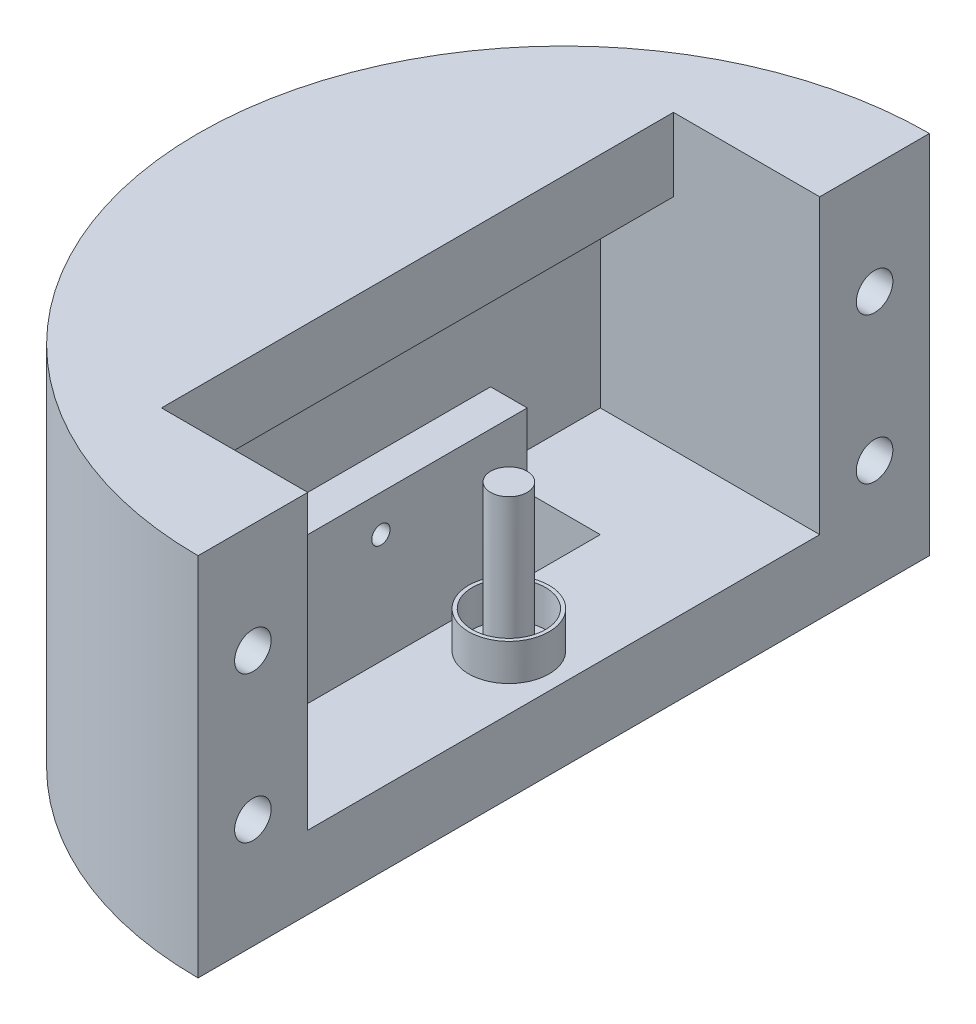
ISO-10303-21;
HEADER;
FILE_DESCRIPTION(('STEP AP214'),'2;1');
FILE_NAME('part.step','',(''),(''),'','','');
FILE_SCHEMA(('AUTOMOTIVE_DESIGN { 1 0 10303 214 1 1 1 1 }'));
ENDSEC;
DATA;
#1=APPLICATION_CONTEXT('core data for automotive mechanical design processes');
#2=APPLICATION_PROTOCOL_DEFINITION('international standard','automotive_design',2000,#1);
#3=PRODUCT_CONTEXT('',#1,'mechanical');
#4=PRODUCT('Part','Part','',(#3));
#5=PRODUCT_RELATED_PRODUCT_CATEGORY('part','',(#4));
#6=PRODUCT_DEFINITION_FORMATION('','',#4);
#7=PRODUCT_DEFINITION_CONTEXT('part definition',#1,'design');
#8=PRODUCT_DEFINITION('design','',#6,#7);
#9=PRODUCT_DEFINITION_SHAPE('','',#8);
#10=(LENGTH_UNIT() NAMED_UNIT(*) SI_UNIT(.MILLI.,.METRE.));
#11=(NAMED_UNIT(*) PLANE_ANGLE_UNIT() SI_UNIT($,.RADIAN.));
#12=(NAMED_UNIT(*) SI_UNIT($,.STERADIAN.) SOLID_ANGLE_UNIT());
#13=UNCERTAINTY_MEASURE_WITH_UNIT(LENGTH_MEASURE(1.E-05),#10,'distance_accuracy_value','');
#14=(GEOMETRIC_REPRESENTATION_CONTEXT(3) GLOBAL_UNCERTAINTY_ASSIGNED_CONTEXT((#13)) GLOBAL_UNIT_ASSIGNED_CONTEXT((#10,
#11,#12)) REPRESENTATION_CONTEXT('',''));
#15=CARTESIAN_POINT('',(0.,0.,0.));
#16=DIRECTION('',(0.,0.,1.));
#17=DIRECTION('',(1.,0.,0.));
#18=AXIS2_PLACEMENT_3D('',#15,#16,#17);
#19=CARTESIAN_POINT('',(-0.5,5.,-3.5));
#20=DIRECTION('',(1.,0.,0.));
#21=DIRECTION('',(0.,0.,-1.));
#22=AXIS2_PLACEMENT_3D('',#19,#20,#21);
#23=PLANE('',#22);
#24=DIRECTION('',(0.,-1.,0.));
#25=VECTOR('',#24,1.);
#26=CARTESIAN_POINT('',(-0.5,5.,-3.5));
#27=LINE('',#26,#25);
#28=CARTESIAN_POINT('',(-0.5,4.,-3.5));
#29=VERTEX_POINT('',#28);
#30=CARTESIAN_POINT('',(-0.5,1.,-3.5));
#31=VERTEX_POINT('',#30);
#32=EDGE_CURVE('E204',#29,#31,#27,.T.);
#33=ORIENTED_EDGE('',*,*,#32,.F.);
#34=DIRECTION('',(0.,0.,-1.));
#35=VECTOR('',#34,1.);
#36=CARTESIAN_POINT('',(-0.5,4.,-3.5));
#37=LINE('',#36,#35);
#38=CARTESIAN_POINT('',(-0.5,4.,3.5));
#39=VERTEX_POINT('',#38);
#40=EDGE_CURVE('E298',#39,#29,#37,.T.);
#41=ORIENTED_EDGE('',*,*,#40,.F.);
#42=DIRECTION('',(0.,-1.,0.));
#43=VECTOR('',#42,1.);
#44=CARTESIAN_POINT('',(-0.5,5.,3.5));
#45=LINE('',#44,#43);
#46=CARTESIAN_POINT('',(-0.5,1.,3.5));
#47=VERTEX_POINT('',#46);
#48=EDGE_CURVE('E221',#39,#47,#45,.T.);
#49=ORIENTED_EDGE('',*,*,#48,.T.);
#50=DIRECTION('',(0.,0.,1.));
#51=VECTOR('',#50,1.);
#52=CARTESIAN_POINT('',(-0.5,1.,-3.5));
#53=LINE('',#52,#51);
#54=CARTESIAN_POINT('',(-0.5,1.,2.));
#55=VERTEX_POINT('',#54);
#56=EDGE_CURVE('E208',#55,#47,#53,.T.);
#57=ORIENTED_EDGE('',*,*,#56,.F.);
#58=DIRECTION('',(0.,-1.,0.));
#59=VECTOR('',#58,1.);
#60=CARTESIAN_POINT('',(-0.5,2.,2.));
#61=LINE('',#60,#59);
#62=CARTESIAN_POINT('',(-0.5,2.,2.));
#63=VERTEX_POINT('',#62);
#64=EDGE_CURVE('E174',#63,#55,#61,.T.);
#65=ORIENTED_EDGE('',*,*,#64,.F.);
#66=DIRECTION('',(0.,0.,1.));
#67=VECTOR('',#66,1.);
#68=CARTESIAN_POINT('',(-0.5,2.,-2.));
#69=LINE('',#68,#67);
#70=CARTESIAN_POINT('',(-0.5,2.,-2.));
#71=VERTEX_POINT('',#70);
#72=EDGE_CURVE('E154',#71,#63,#69,.T.);
#73=ORIENTED_EDGE('',*,*,#72,.F.);
#74=DIRECTION('',(0.,-1.,0.));
#75=VECTOR('',#74,1.);
#76=CARTESIAN_POINT('',(-0.5,2.,-2.));
#77=LINE('',#76,#75);
#78=CARTESIAN_POINT('',(-0.5,1.,-2.));
#79=VERTEX_POINT('',#78);
#80=EDGE_CURVE('E151',#71,#79,#77,.T.);
#81=ORIENTED_EDGE('',*,*,#80,.T.);
#82=EDGE_CURVE('E209',#31,#79,#53,.T.);
#83=ORIENTED_EDGE('',*,*,#82,.F.);
#84=EDGE_LOOP('',(#33,#41,#49,#57,#65,#73,#81,#83));
#85=FACE_BOUND('',#84,.T.);
#86=ADVANCED_FACE('F33',(#85),#23,.T.);
#87=CARTESIAN_POINT('',(2.5,5.,-3.5));
#88=DIRECTION('',(0.,0.,1.));
#89=DIRECTION('',(1.,0.,0.));
#90=AXIS2_PLACEMENT_3D('',#87,#88,#89);
#91=PLANE('',#90);
#92=DIRECTION('',(0.,1.,0.));
#93=VECTOR('',#92,1.);
#94=CARTESIAN_POINT('',(0.5,5.,-3.5));
#95=LINE('',#94,#93);
#96=CARTESIAN_POINT('',(0.5,4.,-3.5));
#97=VERTEX_POINT('',#96);
#98=CARTESIAN_POINT('',(0.5,5.,-3.5));
#99=VERTEX_POINT('',#98);
#100=EDGE_CURVE('E48',#97,#99,#95,.T.);
#101=ORIENTED_EDGE('',*,*,#100,.F.);
#102=DIRECTION('',(-1.,0.,0.));
#103=VECTOR('',#102,1.);
#104=CARTESIAN_POINT('',(0.5,4.,-3.5));
#105=LINE('',#104,#103);
#106=EDGE_CURVE('E53',#97,#29,#105,.T.);
#107=ORIENTED_EDGE('',*,*,#106,.T.);
#108=ORIENTED_EDGE('',*,*,#32,.T.);
#109=DIRECTION('',(-1.,0.,0.));
#110=VECTOR('',#109,1.);
#111=CARTESIAN_POINT('',(2.5,1.,-3.5));
#112=LINE('',#111,#110);
#113=CARTESIAN_POINT('',(2.5,1.,-3.5));
#114=VERTEX_POINT('',#113);
#115=EDGE_CURVE('E205',#114,#31,#112,.T.);
#116=ORIENTED_EDGE('',*,*,#115,.F.);
#117=DIRECTION('',(0.,-1.,0.));
#118=VECTOR('',#117,1.);
#119=CARTESIAN_POINT('',(2.5,5.,-3.5));
#120=LINE('',#119,#118);
#121=CARTESIAN_POINT('',(2.5,5.,-3.5));
#122=VERTEX_POINT('',#121);
#123=EDGE_CURVE('E214',#122,#114,#120,.T.);
#124=ORIENTED_EDGE('',*,*,#123,.F.);
#125=DIRECTION('',(-1.,0.,0.));
#126=VECTOR('',#125,1.);
#127=CARTESIAN_POINT('',(2.5,5.,-3.5));
#128=LINE('',#127,#126);
#129=EDGE_CURVE('E192',#122,#99,#128,.T.);
#130=ORIENTED_EDGE('',*,*,#129,.T.);
#131=EDGE_LOOP('',(#101,#107,#108,#116,#124,#130));
#132=FACE_BOUND('',#131,.T.);
#133=ADVANCED_FACE('F341',(#132),#91,.T.);
#134=CARTESIAN_POINT('',(2.5,5.,3.5));
#135=DIRECTION('',(0.,0.,1.));
#136=DIRECTION('',(1.,0.,0.));
#137=AXIS2_PLACEMENT_3D('',#134,#135,#136);
#138=PLANE('',#137);
#139=DIRECTION('',(-1.,0.,0.));
#140=VECTOR('',#139,1.);
#141=CARTESIAN_POINT('',(0.5,4.,3.5));
#142=LINE('',#141,#140);
#143=CARTESIAN_POINT('',(0.5,4.,3.5));
#144=VERTEX_POINT('',#143);
#145=EDGE_CURVE('E266',#144,#39,#142,.T.);
#146=ORIENTED_EDGE('',*,*,#145,.F.);
#147=DIRECTION('',(0.,-1.,0.));
#148=VECTOR('',#147,1.);
#149=CARTESIAN_POINT('',(0.5,5.,3.5));
#150=LINE('',#149,#148);
#151=CARTESIAN_POINT('',(0.5,5.,3.5));
#152=VERTEX_POINT('',#151);
#153=EDGE_CURVE('E306',#152,#144,#150,.T.);
#154=ORIENTED_EDGE('',*,*,#153,.F.);
#155=DIRECTION('',(-1.,0.,0.));
#156=VECTOR('',#155,1.);
#157=CARTESIAN_POINT('',(2.5,5.,3.5));
#158=LINE('',#157,#156);
#159=CARTESIAN_POINT('',(2.5,5.,3.5));
#160=VERTEX_POINT('',#159);
#161=EDGE_CURVE('E194',#160,#152,#158,.T.);
#162=ORIENTED_EDGE('',*,*,#161,.F.);
#163=DIRECTION('',(0.,-1.,0.));
#164=VECTOR('',#163,1.);
#165=CARTESIAN_POINT('',(2.5,5.,3.5));
#166=LINE('',#165,#164);
#167=CARTESIAN_POINT('',(2.5,1.,3.5));
#168=VERTEX_POINT('',#167);
#169=EDGE_CURVE('E218',#160,#168,#166,.T.);
#170=ORIENTED_EDGE('',*,*,#169,.T.);
#171=DIRECTION('',(-1.,0.,0.));
#172=VECTOR('',#171,1.);
#173=CARTESIAN_POINT('',(2.5,1.,3.5));
#174=LINE('',#173,#172);
#175=EDGE_CURVE('E195',#168,#47,#174,.T.);
#176=ORIENTED_EDGE('',*,*,#175,.T.);
#177=ORIENTED_EDGE('',*,*,#48,.F.);
#178=EDGE_LOOP('',(#146,#154,#162,#170,#176,#177));
#179=FACE_BOUND('',#178,.T.);
#180=ADVANCED_FACE('F300',(#179),#138,.F.);
#181=CARTESIAN_POINT('',(0.,1.,0.));
#182=DIRECTION('',(0.,-1.,0.));
#183=DIRECTION('',(0.,0.,-1.));
#184=AXIS2_PLACEMENT_3D('',#181,#182,#183);
#185=PLANE('',#184);
#186=CARTESIAN_POINT('',(1.75,1.,0.));
#187=DIRECTION('',(0.,-1.,0.));
#188=DIRECTION('',(0.,0.,-1.));
#189=AXIS2_PLACEMENT_3D('',#186,#187,#188);
#190=CIRCLE('',#189,0.55);
#191=CARTESIAN_POINT('',(1.75,1.,-0.549999999999999));
#192=VERTEX_POINT('',#191);
#193=EDGE_CURVE('E11',#192,#192,#190,.F.);
#194=ORIENTED_EDGE('',*,*,#193,.F.);
#195=EDGE_LOOP('',(#194));
#196=FACE_BOUND('',#195,.T.);
#197=DIRECTION('',(-1.,0.,0.));
#198=VECTOR('',#197,1.);
#199=CARTESIAN_POINT('',(0.,1.,-2.));
#200=LINE('',#199,#198);
#201=CARTESIAN_POINT('',(0.,1.,-2.));
#202=VERTEX_POINT('',#201);
#203=EDGE_CURVE('E278',#202,#79,#200,.T.);
#204=ORIENTED_EDGE('',*,*,#203,.F.);
#205=DIRECTION('',(-1.,0.,0.));
#206=VECTOR('',#205,1.);
#207=CARTESIAN_POINT('',(0.,1.,-2.));
#208=LINE('',#207,#206);
#209=CARTESIAN_POINT('',(1.,1.,-2.));
#210=VERTEX_POINT('',#209);
#211=EDGE_CURVE('E172',#210,#202,#208,.T.);
#212=ORIENTED_EDGE('',*,*,#211,.F.);
#213=DIRECTION('',(0.,0.,-1.));
#214=VECTOR('',#213,1.);
#215=CARTESIAN_POINT('',(1.,1.,-2.));
#216=LINE('',#215,#214);
#217=CARTESIAN_POINT('',(1.,1.,2.));
#218=VERTEX_POINT('',#217);
#219=EDGE_CURVE('E170',#218,#210,#216,.T.);
#220=ORIENTED_EDGE('',*,*,#219,.F.);
#221=DIRECTION('',(1.,0.,0.));
#222=VECTOR('',#221,1.);
#223=CARTESIAN_POINT('',(0.,1.,2.));
#224=LINE('',#223,#222);
#225=CARTESIAN_POINT('',(0.,1.,2.));
#226=VERTEX_POINT('',#225);
#227=EDGE_CURVE('E179',#226,#218,#224,.T.);
#228=ORIENTED_EDGE('',*,*,#227,.F.);
#229=DIRECTION('',(1.,0.,0.));
#230=VECTOR('',#229,1.);
#231=CARTESIAN_POINT('',(0.,1.,2.));
#232=LINE('',#231,#230);
#233=EDGE_CURVE('E163',#55,#226,#232,.T.);
#234=ORIENTED_EDGE('',*,*,#233,.F.);
#235=ORIENTED_EDGE('',*,*,#56,.T.);
#236=ORIENTED_EDGE('',*,*,#175,.F.);
#237=DIRECTION('',(0.,0.,-1.));
#238=VECTOR('',#237,1.);
#239=CARTESIAN_POINT('',(2.5,1.,5.));
#240=LINE('',#239,#238);
#241=EDGE_CURVE('E224',#168,#114,#240,.T.);
#242=ORIENTED_EDGE('',*,*,#241,.T.);
#243=ORIENTED_EDGE('',*,*,#115,.T.);
#244=ORIENTED_EDGE('',*,*,#82,.T.);
#245=EDGE_LOOP('',(#204,#212,#220,#228,#234,#235,#236,#242,#243,#244));
#246=FACE_BOUND('',#245,.T.);
#247=ADVANCED_FACE('F260',(#196,#246),#185,.F.);
#248=CARTESIAN_POINT('',(2.5,1.,5.));
#249=DIRECTION('',(-1.,0.,0.));
#250=DIRECTION('',(0.,0.,1.));
#251=AXIS2_PLACEMENT_3D('',#248,#249,#250);
#252=PLANE('',#251);
#253=CARTESIAN_POINT('',(2.5,1.50311049925089,-4.25));
#254=DIRECTION('',(1.,0.,0.));
#255=DIRECTION('',(0.,0.,-1.));
#256=AXIS2_PLACEMENT_3D('',#253,#254,#255);
#257=CIRCLE('',#256,0.25);
#258=CARTESIAN_POINT('',(2.5,1.50311049925089,-4.5));
#259=VERTEX_POINT('',#258);
#260=EDGE_CURVE('E321',#259,#259,#257,.T.);
#261=ORIENTED_EDGE('',*,*,#260,.F.);
#262=EDGE_LOOP('',(#261));
#263=FACE_BOUND('',#262,.T.);
#264=CARTESIAN_POINT('',(2.5,3.50311049925089,4.25));
#265=DIRECTION('',(1.,0.,0.));
#266=DIRECTION('',(0.,0.,-1.));
#267=AXIS2_PLACEMENT_3D('',#264,#265,#266);
#268=CIRCLE('',#267,0.249999999999999);
#269=CARTESIAN_POINT('',(2.5,3.50311049925089,4.));
#270=VERTEX_POINT('',#269);
#271=EDGE_CURVE('E482',#270,#270,#268,.T.);
#272=ORIENTED_EDGE('',*,*,#271,.F.);
#273=EDGE_LOOP('',(#272));
#274=FACE_BOUND('',#273,.T.);
#275=CARTESIAN_POINT('',(2.5,1.50311049925089,4.25));
#276=DIRECTION('',(1.,0.,0.));
#277=DIRECTION('',(0.,0.,-1.));
#278=AXIS2_PLACEMENT_3D('',#275,#276,#277);
#279=CIRCLE('',#278,0.25);
#280=CARTESIAN_POINT('',(2.5,1.50311049925089,4.));
#281=VERTEX_POINT('',#280);
#282=EDGE_CURVE('E471',#281,#281,#279,.T.);
#283=ORIENTED_EDGE('',*,*,#282,.F.);
#284=EDGE_LOOP('',(#283));
#285=FACE_BOUND('',#284,.T.);
#286=CARTESIAN_POINT('',(2.5,3.50311049925089,-4.25));
#287=DIRECTION('',(1.,0.,0.));
#288=DIRECTION('',(0.,0.,-1.));
#289=AXIS2_PLACEMENT_3D('',#286,#287,#288);
#290=CIRCLE('',#289,0.249999999999999);
#291=CARTESIAN_POINT('',(2.5,3.50311049925089,-4.5));
#292=VERTEX_POINT('',#291);
#293=EDGE_CURVE('E316',#292,#292,#290,.T.);
#294=ORIENTED_EDGE('',*,*,#293,.F.);
#295=EDGE_LOOP('',(#294));
#296=FACE_BOUND('',#295,.T.);
#297=DIRECTION('',(0.,0.,-1.));
#298=VECTOR('',#297,1.);
#299=CARTESIAN_POINT('',(2.5,0.,5.));
#300=LINE('',#299,#298);
#301=CARTESIAN_POINT('',(2.5,0.,5.));
#302=VERTEX_POINT('',#301);
#303=CARTESIAN_POINT('',(2.5,0.,-5.));
#304=VERTEX_POINT('',#303);
#305=EDGE_CURVE('E217',#302,#304,#300,.T.);
#306=ORIENTED_EDGE('',*,*,#305,.T.);
#307=DIRECTION('',(0.,-1.,0.));
#308=VECTOR('',#307,1.);
#309=CARTESIAN_POINT('',(2.5,1.,-5.));
#310=LINE('',#309,#308);
#311=CARTESIAN_POINT('',(2.5,5.,-5.));
#312=VERTEX_POINT('',#311);
#313=EDGE_CURVE('E230',#312,#304,#310,.T.);
#314=ORIENTED_EDGE('',*,*,#313,.F.);
#315=DIRECTION('',(0.,0.,-1.));
#316=VECTOR('',#315,1.);
#317=CARTESIAN_POINT('',(2.5,5.,-3.5));
#318=LINE('',#317,#316);
#319=EDGE_CURVE('E201',#122,#312,#318,.T.);
#320=ORIENTED_EDGE('',*,*,#319,.F.);
#321=ORIENTED_EDGE('',*,*,#123,.T.);
#322=ORIENTED_EDGE('',*,*,#241,.F.);
#323=ORIENTED_EDGE('',*,*,#169,.F.);
#324=DIRECTION('',(0.,0.,1.));
#325=VECTOR('',#324,1.);
#326=CARTESIAN_POINT('',(2.5,5.,3.5));
#327=LINE('',#326,#325);
#328=CARTESIAN_POINT('',(2.5,5.,5.));
#329=VERTEX_POINT('',#328);
#330=EDGE_CURVE('E198',#160,#329,#327,.T.);
#331=ORIENTED_EDGE('',*,*,#330,.T.);
#332=DIRECTION('',(0.,-1.,0.));
#333=VECTOR('',#332,1.);
#334=CARTESIAN_POINT('',(2.5,1.,5.));
#335=LINE('',#334,#333);
#336=EDGE_CURVE('E226',#329,#302,#335,.T.);
#337=ORIENTED_EDGE('',*,*,#336,.T.);
#338=EDGE_LOOP('',(#306,#314,#320,#321,#322,#323,#331,#337));
#339=FACE_BOUND('',#338,.T.);
#340=ADVANCED_FACE('F336',(#263,#274,#285,#296,#339),#252,.F.);
#341=CARTESIAN_POINT('',(0.,0.,0.));
#342=DIRECTION('',(0.,-1.,0.));
#343=DIRECTION('',(0.,0.,-1.));
#344=AXIS2_PLACEMENT_3D('',#341,#342,#343);
#345=PLANE('',#344);
#346=DIRECTION('',(0.,0.,1.));
#347=VECTOR('',#346,1.);
#348=CARTESIAN_POINT('',(1.,0.,0.));
#349=LINE('',#348,#347);
#350=CARTESIAN_POINT('',(1.,0.,-2.));
#351=VERTEX_POINT('',#350);
#352=CARTESIAN_POINT('',(1.,0.,2.));
#353=VERTEX_POINT('',#352);
#354=EDGE_CURVE('E249',#351,#353,#349,.T.);
#355=ORIENTED_EDGE('',*,*,#354,.F.);
#356=DIRECTION('',(1.,0.,0.));
#357=VECTOR('',#356,1.);
#358=CARTESIAN_POINT('',(0.,0.,-2.));
#359=LINE('',#358,#357);
#360=CARTESIAN_POINT('',(0.,0.,-2.));
#361=VERTEX_POINT('',#360);
#362=EDGE_CURVE('E241',#361,#351,#359,.T.);
#363=ORIENTED_EDGE('',*,*,#362,.F.);
#364=DIRECTION('',(0.,0.,-1.));
#365=VECTOR('',#364,1.);
#366=CARTESIAN_POINT('',(0.,0.,0.));
#367=LINE('',#366,#365);
#368=CARTESIAN_POINT('',(0.,0.,2.));
#369=VERTEX_POINT('',#368);
#370=EDGE_CURVE('E245',#369,#361,#367,.T.);
#371=ORIENTED_EDGE('',*,*,#370,.F.);
#372=DIRECTION('',(-1.,0.,0.));
#373=VECTOR('',#372,1.);
#374=CARTESIAN_POINT('',(0.,0.,2.));
#375=LINE('',#374,#373);
#376=EDGE_CURVE('E247',#353,#369,#375,.T.);
#377=ORIENTED_EDGE('',*,*,#376,.F.);
#378=EDGE_LOOP('',(#355,#363,#371,#377));
#379=FACE_BOUND('',#378,.T.);
#380=CARTESIAN_POINT('',(2.5,0.,0.));
#381=DIRECTION('',(0.,-1.,0.));
#382=DIRECTION('',(0.,0.,-1.));
#383=AXIS2_PLACEMENT_3D('',#380,#381,#382);
#384=CIRCLE('',#383,5.);
#385=CARTESIAN_POINT('',(-2.5,0.,0.));
#386=VERTEX_POINT('',#385);
#387=EDGE_CURVE('E233',#302,#386,#384,.T.);
#388=ORIENTED_EDGE('',*,*,#387,.T.);
#389=CARTESIAN_POINT('',(2.5,0.,0.));
#390=DIRECTION('',(0.,-1.,0.));
#391=DIRECTION('',(0.,0.,-1.));
#392=AXIS2_PLACEMENT_3D('',#389,#390,#391);
#393=CIRCLE('',#392,5.);
#394=EDGE_CURVE('E235',#386,#304,#393,.T.);
#395=ORIENTED_EDGE('',*,*,#394,.T.);
#396=ORIENTED_EDGE('',*,*,#305,.F.);
#397=EDGE_LOOP('',(#388,#395,#396));
#398=FACE_BOUND('',#397,.T.);
#399=ADVANCED_FACE('F353',(#379,#398),#345,.T.);
#400=CARTESIAN_POINT('',(0.,5.,0.));
#401=DIRECTION('',(0.,1.,0.));
#402=DIRECTION('',(0.,0.,1.));
#403=AXIS2_PLACEMENT_3D('',#400,#401,#402);
#404=PLANE('',#403);
#405=ORIENTED_EDGE('',*,*,#319,.T.);
#406=CARTESIAN_POINT('',(2.5,5.,0.));
#407=DIRECTION('',(0.,1.,0.));
#408=DIRECTION('',(0.,0.,1.));
#409=AXIS2_PLACEMENT_3D('',#406,#407,#408);
#410=CIRCLE('',#409,5.);
#411=CARTESIAN_POINT('',(-2.5,5.,0.));
#412=VERTEX_POINT('',#411);
#413=EDGE_CURVE('E239',#312,#412,#410,.T.);
#414=ORIENTED_EDGE('',*,*,#413,.T.);
#415=CARTESIAN_POINT('',(2.5,5.,0.));
#416=DIRECTION('',(0.,1.,0.));
#417=DIRECTION('',(0.,0.,1.));
#418=AXIS2_PLACEMENT_3D('',#415,#416,#417);
#419=CIRCLE('',#418,5.);
#420=EDGE_CURVE('E237',#412,#329,#419,.T.);
#421=ORIENTED_EDGE('',*,*,#420,.T.);
#422=ORIENTED_EDGE('',*,*,#330,.F.);
#423=ORIENTED_EDGE('',*,*,#161,.T.);
#424=DIRECTION('',(0.,0.,1.));
#425=VECTOR('',#424,1.);
#426=CARTESIAN_POINT('',(0.5,5.,-3.5));
#427=LINE('',#426,#425);
#428=EDGE_CURVE('E309',#99,#152,#427,.T.);
#429=ORIENTED_EDGE('',*,*,#428,.F.);
#430=ORIENTED_EDGE('',*,*,#129,.F.);
#431=EDGE_LOOP('',(#405,#414,#421,#422,#423,#429,#430));
#432=FACE_BOUND('',#431,.T.);
#433=ADVANCED_FACE('F331',(#432),#404,.T.);
#434=CARTESIAN_POINT('',(2.5,1.,0.));
#435=DIRECTION('',(0.,-1.,0.));
#436=DIRECTION('',(0.,0.,-1.));
#437=AXIS2_PLACEMENT_3D('',#434,#435,#436);
#438=CYLINDRICAL_SURFACE('',#437,5.);
#439=ORIENTED_EDGE('',*,*,#336,.F.);
#440=ORIENTED_EDGE('',*,*,#420,.F.);
#441=DIRECTION('',(0.,-1.,0.));
#442=VECTOR('',#441,1.);
#443=CARTESIAN_POINT('',(-2.5,1.,0.));
#444=LINE('',#443,#442);
#445=EDGE_CURVE('E185',#386,#412,#444,.F.);
#446=ORIENTED_EDGE('',*,*,#445,.F.);
#447=ORIENTED_EDGE('',*,*,#387,.F.);
#448=EDGE_LOOP('',(#439,#440,#446,#447));
#449=FACE_BOUND('',#448,.T.);
#450=ADVANCED_FACE('F35',(#449),#438,.T.);
#451=CARTESIAN_POINT('',(2.5,1.,0.));
#452=DIRECTION('',(0.,-1.,0.));
#453=DIRECTION('',(0.,0.,-1.));
#454=AXIS2_PLACEMENT_3D('',#451,#452,#453);
#455=CYLINDRICAL_SURFACE('',#454,5.);
#456=ORIENTED_EDGE('',*,*,#413,.F.);
#457=ORIENTED_EDGE('',*,*,#313,.T.);
#458=ORIENTED_EDGE('',*,*,#394,.F.);
#459=ORIENTED_EDGE('',*,*,#445,.T.);
#460=EDGE_LOOP('',(#456,#457,#458,#459));
#461=FACE_BOUND('',#460,.T.);
#462=ADVANCED_FACE('F359',(#461),#455,.T.);
#463=CARTESIAN_POINT('',(1.,-3.,-2.));
#464=DIRECTION('',(1.,0.,0.));
#465=DIRECTION('',(0.,0.,-1.));
#466=AXIS2_PLACEMENT_3D('',#463,#464,#465);
#467=PLANE('',#466);
#468=ORIENTED_EDGE('',*,*,#354,.T.);
#469=DIRECTION('',(0.,1.,0.));
#470=VECTOR('',#469,1.);
#471=CARTESIAN_POINT('',(1.,-3.,2.));
#472=LINE('',#471,#470);
#473=EDGE_CURVE('E183',#353,#218,#472,.T.);
#474=ORIENTED_EDGE('',*,*,#473,.T.);
#475=ORIENTED_EDGE('',*,*,#219,.T.);
#476=DIRECTION('',(0.,1.,0.));
#477=VECTOR('',#476,1.);
#478=CARTESIAN_POINT('',(1.,-3.,-2.));
#479=LINE('',#478,#477);
#480=EDGE_CURVE('E182',#351,#210,#479,.T.);
#481=ORIENTED_EDGE('',*,*,#480,.F.);
#482=EDGE_LOOP('',(#468,#474,#475,#481));
#483=FACE_BOUND('',#482,.T.);
#484=ADVANCED_FACE('F361',(#483),#467,.F.);
#485=CARTESIAN_POINT('',(0.,-3.,2.));
#486=DIRECTION('',(0.,0.,1.));
#487=DIRECTION('',(1.,0.,0.));
#488=AXIS2_PLACEMENT_3D('',#485,#486,#487);
#489=PLANE('',#488);
#490=ORIENTED_EDGE('',*,*,#376,.T.);
#491=DIRECTION('',(0.,1.,0.));
#492=VECTOR('',#491,1.);
#493=CARTESIAN_POINT('',(0.,-3.,2.));
#494=LINE('',#493,#492);
#495=EDGE_CURVE('E186',#369,#226,#494,.T.);
#496=ORIENTED_EDGE('',*,*,#495,.T.);
#497=ORIENTED_EDGE('',*,*,#227,.T.);
#498=ORIENTED_EDGE('',*,*,#473,.F.);
#499=EDGE_LOOP('',(#490,#496,#497,#498));
#500=FACE_BOUND('',#499,.T.);
#501=ADVANCED_FACE('F367',(#500),#489,.F.);
#502=CARTESIAN_POINT('',(0.,-3.,-2.));
#503=DIRECTION('',(-1.,0.,0.));
#504=DIRECTION('',(0.,0.,1.));
#505=AXIS2_PLACEMENT_3D('',#502,#503,#504);
#506=PLANE('',#505);
#507=CARTESIAN_POINT('',(0.,1.5,0.));
#508=DIRECTION('',(1.,0.,0.));
#509=DIRECTION('',(0.,0.,-1.));
#510=AXIS2_PLACEMENT_3D('',#507,#508,#509);
#511=CIRCLE('',#510,0.125);
#512=CARTESIAN_POINT('',(0.,1.5,-0.125));
#513=VERTEX_POINT('',#512);
#514=EDGE_CURVE('E468',#513,#513,#511,.T.);
#515=ORIENTED_EDGE('',*,*,#514,.F.);
#516=EDGE_LOOP('',(#515));
#517=FACE_BOUND('',#516,.T.);
#518=ORIENTED_EDGE('',*,*,#370,.T.);
#519=DIRECTION('',(0.,1.,0.));
#520=VECTOR('',#519,1.);
#521=CARTESIAN_POINT('',(0.,-3.,-2.));
#522=LINE('',#521,#520);
#523=EDGE_CURVE('E168',#361,#202,#522,.T.);
#524=ORIENTED_EDGE('',*,*,#523,.T.);
#525=DIRECTION('',(0.,-1.,0.));
#526=VECTOR('',#525,1.);
#527=CARTESIAN_POINT('',(0.,2.,-2.));
#528=LINE('',#527,#526);
#529=CARTESIAN_POINT('',(0.,2.,-2.));
#530=VERTEX_POINT('',#529);
#531=EDGE_CURVE('E148',#530,#202,#528,.T.);
#532=ORIENTED_EDGE('',*,*,#531,.F.);
#533=DIRECTION('',(0.,0.,-1.));
#534=VECTOR('',#533,1.);
#535=CARTESIAN_POINT('',(0.,2.,-2.));
#536=LINE('',#535,#534);
#537=CARTESIAN_POINT('',(0.,2.,2.));
#538=VERTEX_POINT('',#537);
#539=EDGE_CURVE('E155',#538,#530,#536,.T.);
#540=ORIENTED_EDGE('',*,*,#539,.F.);
#541=DIRECTION('',(0.,-1.,0.));
#542=VECTOR('',#541,1.);
#543=CARTESIAN_POINT('',(0.,2.,2.));
#544=LINE('',#543,#542);
#545=EDGE_CURVE('E282',#538,#226,#544,.T.);
#546=ORIENTED_EDGE('',*,*,#545,.T.);
#547=ORIENTED_EDGE('',*,*,#495,.F.);
#548=EDGE_LOOP('',(#518,#524,#532,#540,#546,#547));
#549=FACE_BOUND('',#548,.T.);
#550=ADVANCED_FACE('F167',(#517,#549),#506,.F.);
#551=CARTESIAN_POINT('',(0.,-3.,-2.));
#552=DIRECTION('',(0.,0.,-1.));
#553=DIRECTION('',(-1.,0.,0.));
#554=AXIS2_PLACEMENT_3D('',#551,#552,#553);
#555=PLANE('',#554);
#556=ORIENTED_EDGE('',*,*,#362,.T.);
#557=ORIENTED_EDGE('',*,*,#480,.T.);
#558=ORIENTED_EDGE('',*,*,#211,.T.);
#559=ORIENTED_EDGE('',*,*,#523,.F.);
#560=EDGE_LOOP('',(#556,#557,#558,#559));
#561=FACE_BOUND('',#560,.T.);
#562=ADVANCED_FACE('F385',(#561),#555,.F.);
#563=CARTESIAN_POINT('',(0.,2.,-2.));
#564=DIRECTION('',(0.,0.,1.));
#565=DIRECTION('',(1.,0.,0.));
#566=AXIS2_PLACEMENT_3D('',#563,#564,#565);
#567=PLANE('',#566);
#568=ORIENTED_EDGE('',*,*,#203,.T.);
#569=ORIENTED_EDGE('',*,*,#80,.F.);
#570=DIRECTION('',(-1.,0.,0.));
#571=VECTOR('',#570,1.);
#572=CARTESIAN_POINT('',(0.,2.,-2.));
#573=LINE('',#572,#571);
#574=EDGE_CURVE('E144',#530,#71,#573,.T.);
#575=ORIENTED_EDGE('',*,*,#574,.F.);
#576=ORIENTED_EDGE('',*,*,#531,.T.);
#577=EDGE_LOOP('',(#568,#569,#575,#576));
#578=FACE_BOUND('',#577,.T.);
#579=ADVANCED_FACE('F146',(#578),#567,.F.);
#580=CARTESIAN_POINT('',(0.,2.,2.));
#581=DIRECTION('',(0.,0.,-1.));
#582=DIRECTION('',(-1.,0.,0.));
#583=AXIS2_PLACEMENT_3D('',#580,#581,#582);
#584=PLANE('',#583);
#585=ORIENTED_EDGE('',*,*,#233,.T.);
#586=ORIENTED_EDGE('',*,*,#545,.F.);
#587=DIRECTION('',(1.,0.,0.));
#588=VECTOR('',#587,1.);
#589=CARTESIAN_POINT('',(0.,2.,2.));
#590=LINE('',#589,#588);
#591=EDGE_CURVE('E160',#63,#538,#590,.T.);
#592=ORIENTED_EDGE('',*,*,#591,.F.);
#593=ORIENTED_EDGE('',*,*,#64,.T.);
#594=EDGE_LOOP('',(#585,#586,#592,#593));
#595=FACE_BOUND('',#594,.T.);
#596=ADVANCED_FACE('F289',(#595),#584,.F.);
#597=CARTESIAN_POINT('',(0.,2.,0.));
#598=DIRECTION('',(0.,-1.,0.));
#599=DIRECTION('',(0.,0.,-1.));
#600=AXIS2_PLACEMENT_3D('',#597,#598,#599);
#601=PLANE('',#600);
#602=ORIENTED_EDGE('',*,*,#539,.T.);
#603=ORIENTED_EDGE('',*,*,#574,.T.);
#604=ORIENTED_EDGE('',*,*,#72,.T.);
#605=ORIENTED_EDGE('',*,*,#591,.T.);
#606=EDGE_LOOP('',(#602,#603,#604,#605));
#607=FACE_BOUND('',#606,.T.);
#608=ADVANCED_FACE('F158',(#607),#601,.F.);
#609=CARTESIAN_POINT('',(1.75,1.5,0.));
#610=DIRECTION('',(0.,1.,0.));
#611=DIRECTION('',(0.,0.,1.));
#612=AXIS2_PLACEMENT_3D('',#609,#610,#611);
#613=PLANE('',#612);
#614=CARTESIAN_POINT('',(1.75,1.5,0.));
#615=DIRECTION('',(0.,1.,0.));
#616=DIRECTION('',(0.,0.,1.));
#617=AXIS2_PLACEMENT_3D('',#614,#615,#616);
#618=CIRCLE('',#617,0.55);
#619=CARTESIAN_POINT('',(1.75,1.5,0.550000000000001));
#620=VERTEX_POINT('',#619);
#621=EDGE_CURVE('E269',#620,#620,#618,.T.);
#622=ORIENTED_EDGE('',*,*,#621,.T.);
#623=EDGE_LOOP('',(#622));
#624=FACE_BOUND('',#623,.T.);
#625=CARTESIAN_POINT('',(1.75,1.5,0.));
#626=DIRECTION('',(0.,1.,0.));
#627=DIRECTION('',(0.,0.,1.));
#628=AXIS2_PLACEMENT_3D('',#625,#626,#627);
#629=CIRCLE('',#628,0.5);
#630=CARTESIAN_POINT('',(1.75,1.5,0.500000000000001));
#631=VERTEX_POINT('',#630);
#632=EDGE_CURVE('E265',#631,#631,#629,.T.);
#633=ORIENTED_EDGE('',*,*,#632,.F.);
#634=EDGE_LOOP('',(#633));
#635=FACE_BOUND('',#634,.T.);
#636=ADVANCED_FACE('F401',(#624,#635),#613,.T.);
#637=CARTESIAN_POINT('',(1.75,1.5,0.));
#638=DIRECTION('',(0.,-1.,0.));
#639=DIRECTION('',(0.,0.,-1.));
#640=AXIS2_PLACEMENT_3D('',#637,#638,#639);
#641=CYLINDRICAL_SURFACE('',#640,0.55);
#642=ORIENTED_EDGE('',*,*,#621,.F.);
#643=EDGE_LOOP('',(#642));
#644=FACE_BOUND('',#643,.T.);
#645=ORIENTED_EDGE('',*,*,#193,.T.);
#646=EDGE_LOOP('',(#645));
#647=FACE_BOUND('',#646,.T.);
#648=ADVANCED_FACE('F410',(#644,#647),#641,.T.);
#649=CARTESIAN_POINT('',(1.75,1.5,0.));
#650=DIRECTION('',(0.,-1.,0.));
#651=DIRECTION('',(0.,0.,-1.));
#652=AXIS2_PLACEMENT_3D('',#649,#650,#651);
#653=CYLINDRICAL_SURFACE('',#652,0.5);
#654=ORIENTED_EDGE('',*,*,#632,.T.);
#655=EDGE_LOOP('',(#654));
#656=FACE_BOUND('',#655,.T.);
#657=CARTESIAN_POINT('',(1.75,1.,0.));
#658=DIRECTION('',(0.,1.,0.));
#659=DIRECTION('',(0.,0.,1.));
#660=AXIS2_PLACEMENT_3D('',#657,#658,#659);
#661=CIRCLE('',#660,0.5);
#662=CARTESIAN_POINT('',(1.75,1.,0.500000000000001));
#663=VERTEX_POINT('',#662);
#664=EDGE_CURVE('E263',#663,#663,#661,.T.);
#665=ORIENTED_EDGE('',*,*,#664,.F.);
#666=EDGE_LOOP('',(#665));
#667=FACE_BOUND('',#666,.T.);
#668=ADVANCED_FACE('F408',(#656,#667),#653,.F.);
#669=CARTESIAN_POINT('',(1.75,3.,0.));
#670=DIRECTION('',(0.,1.,0.));
#671=DIRECTION('',(0.,0.,1.));
#672=AXIS2_PLACEMENT_3D('',#669,#670,#671);
#673=PLANE('',#672);
#674=CARTESIAN_POINT('',(1.75,3.,0.));
#675=DIRECTION('',(0.,1.,0.));
#676=DIRECTION('',(0.,0.,1.));
#677=AXIS2_PLACEMENT_3D('',#674,#675,#676);
#678=CIRCLE('',#677,0.25);
#679=CARTESIAN_POINT('',(1.75,3.,0.250000000000001));
#680=VERTEX_POINT('',#679);
#681=EDGE_CURVE('E276',#680,#680,#678,.T.);
#682=ORIENTED_EDGE('',*,*,#681,.T.);
#683=EDGE_LOOP('',(#682));
#684=FACE_BOUND('',#683,.T.);
#685=ADVANCED_FACE('F404',(#684),#673,.T.);
#686=CARTESIAN_POINT('',(1.75,3.,0.));
#687=DIRECTION('',(0.,-1.,0.));
#688=DIRECTION('',(0.,0.,-1.));
#689=AXIS2_PLACEMENT_3D('',#686,#687,#688);
#690=CYLINDRICAL_SURFACE('',#689,0.25);
#691=ORIENTED_EDGE('',*,*,#681,.F.);
#692=EDGE_LOOP('',(#691));
#693=FACE_BOUND('',#692,.T.);
#694=CARTESIAN_POINT('',(1.75,1.,0.));
#695=DIRECTION('',(0.,-1.,0.));
#696=DIRECTION('',(0.,0.,-1.));
#697=AXIS2_PLACEMENT_3D('',#694,#695,#696);
#698=CIRCLE('',#697,0.25);
#699=CARTESIAN_POINT('',(1.75,1.,-0.249999999999999));
#700=VERTEX_POINT('',#699);
#701=EDGE_CURVE('E41',#700,#700,#698,.F.);
#702=ORIENTED_EDGE('',*,*,#701,.T.);
#703=EDGE_LOOP('',(#702));
#704=FACE_BOUND('',#703,.T.);
#705=ADVANCED_FACE('F253',(#693,#704),#690,.T.);
#706=ORIENTED_EDGE('',*,*,#701,.F.);
#707=EDGE_LOOP('',(#706));
#708=FACE_BOUND('',#707,.T.);
#709=ORIENTED_EDGE('',*,*,#664,.T.);
#710=EDGE_LOOP('',(#709));
#711=FACE_BOUND('',#710,.T.);
#712=ADVANCED_FACE('F255',(#708,#711),#185,.F.);
#713=CARTESIAN_POINT('',(0.5,4.,-3.5));
#714=DIRECTION('',(0.,1.,0.));
#715=DIRECTION('',(0.,0.,1.));
#716=AXIS2_PLACEMENT_3D('',#713,#714,#715);
#717=PLANE('',#716);
#718=ORIENTED_EDGE('',*,*,#40,.T.);
#719=ORIENTED_EDGE('',*,*,#106,.F.);
#720=DIRECTION('',(0.,0.,-1.));
#721=VECTOR('',#720,1.);
#722=CARTESIAN_POINT('',(0.5,4.,-3.5));
#723=LINE('',#722,#721);
#724=EDGE_CURVE('E304',#144,#97,#723,.T.);
#725=ORIENTED_EDGE('',*,*,#724,.F.);
#726=ORIENTED_EDGE('',*,*,#145,.T.);
#727=EDGE_LOOP('',(#718,#719,#725,#726));
#728=FACE_BOUND('',#727,.T.);
#729=ADVANCED_FACE('F258',(#728),#717,.F.);
#730=CARTESIAN_POINT('',(0.5,0.,0.));
#731=DIRECTION('',(-1.,0.,0.));
#732=DIRECTION('',(0.,0.,1.));
#733=AXIS2_PLACEMENT_3D('',#730,#731,#732);
#734=PLANE('',#733);
#735=ORIENTED_EDGE('',*,*,#100,.T.);
#736=ORIENTED_EDGE('',*,*,#428,.T.);
#737=ORIENTED_EDGE('',*,*,#153,.T.);
#738=ORIENTED_EDGE('',*,*,#724,.T.);
#739=EDGE_LOOP('',(#735,#736,#737,#738));
#740=FACE_BOUND('',#739,.T.);
#741=ADVANCED_FACE('F328',(#740),#734,.F.);
#742=CARTESIAN_POINT('',(2.,3.50311049925089,-4.25));
#743=DIRECTION('',(1.,0.,0.));
#744=DIRECTION('',(0.,0.,-1.));
#745=AXIS2_PLACEMENT_3D('',#742,#743,#744);
#746=CYLINDRICAL_SURFACE('',#745,0.249999999999999);
#747=CARTESIAN_POINT('',(2.,3.50311049925089,-4.25));
#748=DIRECTION('',(1.,0.,0.));
#749=DIRECTION('',(0.,0.,-1.));
#750=AXIS2_PLACEMENT_3D('',#747,#748,#749);
#751=CIRCLE('',#750,0.249999999999999);
#752=CARTESIAN_POINT('',(2.,3.50311049925089,-4.5));
#753=VERTEX_POINT('',#752);
#754=EDGE_CURVE('E313',#753,#753,#751,.T.);
#755=ORIENTED_EDGE('',*,*,#754,.F.);
#756=EDGE_LOOP('',(#755));
#757=FACE_BOUND('',#756,.T.);
#758=ORIENTED_EDGE('',*,*,#293,.T.);
#759=EDGE_LOOP('',(#758));
#760=FACE_BOUND('',#759,.T.);
#761=ADVANCED_FACE('F424',(#757,#760),#746,.F.);
#762=CARTESIAN_POINT('',(2.,0.,0.));
#763=DIRECTION('',(1.,0.,0.));
#764=DIRECTION('',(0.,0.,-1.));
#765=AXIS2_PLACEMENT_3D('',#762,#763,#764);
#766=PLANE('',#765);
#767=ORIENTED_EDGE('',*,*,#754,.T.);
#768=EDGE_LOOP('',(#767));
#769=FACE_BOUND('',#768,.T.);
#770=ADVANCED_FACE('F427',(#769),#766,.T.);
#771=CARTESIAN_POINT('',(2.,1.50311049925089,4.25));
#772=DIRECTION('',(1.,0.,0.));
#773=DIRECTION('',(0.,0.,-1.));
#774=AXIS2_PLACEMENT_3D('',#771,#772,#773);
#775=CYLINDRICAL_SURFACE('',#774,0.25);
#776=CARTESIAN_POINT('',(2.,1.50311049925089,4.25));
#777=DIRECTION('',(1.,0.,0.));
#778=DIRECTION('',(0.,0.,-1.));
#779=AXIS2_PLACEMENT_3D('',#776,#777,#778);
#780=CIRCLE('',#779,0.25);
#781=CARTESIAN_POINT('',(2.,1.50311049925089,4.));
#782=VERTEX_POINT('',#781);
#783=EDGE_CURVE('E467',#782,#782,#780,.T.);
#784=ORIENTED_EDGE('',*,*,#783,.F.);
#785=EDGE_LOOP('',(#784));
#786=FACE_BOUND('',#785,.T.);
#787=ORIENTED_EDGE('',*,*,#282,.T.);
#788=EDGE_LOOP('',(#787));
#789=FACE_BOUND('',#788,.T.);
#790=ADVANCED_FACE('F431',(#786,#789),#775,.F.);
#791=CARTESIAN_POINT('',(2.,1.50311049925089,4.25));
#792=DIRECTION('',(1.,0.,0.));
#793=DIRECTION('',(0.,0.,-1.));
#794=AXIS2_PLACEMENT_3D('',#791,#792,#793);
#795=PLANE('',#794);
#796=ORIENTED_EDGE('',*,*,#783,.T.);
#797=EDGE_LOOP('',(#796));
#798=FACE_BOUND('',#797,.T.);
#799=ADVANCED_FACE('F440',(#798),#795,.T.);
#800=CARTESIAN_POINT('',(2.,3.50311049925089,4.25));
#801=DIRECTION('',(1.,0.,0.));
#802=DIRECTION('',(0.,0.,-1.));
#803=AXIS2_PLACEMENT_3D('',#800,#801,#802);
#804=CYLINDRICAL_SURFACE('',#803,0.249999999999999);
#805=CARTESIAN_POINT('',(2.,3.50311049925089,4.25));
#806=DIRECTION('',(1.,0.,0.));
#807=DIRECTION('',(0.,0.,-1.));
#808=AXIS2_PLACEMENT_3D('',#805,#806,#807);
#809=CIRCLE('',#808,0.249999999999999);
#810=CARTESIAN_POINT('',(2.,3.50311049925089,4.));
#811=VERTEX_POINT('',#810);
#812=EDGE_CURVE('E324',#811,#811,#809,.T.);
#813=ORIENTED_EDGE('',*,*,#812,.F.);
#814=EDGE_LOOP('',(#813));
#815=FACE_BOUND('',#814,.T.);
#816=ORIENTED_EDGE('',*,*,#271,.T.);
#817=EDGE_LOOP('',(#816));
#818=FACE_BOUND('',#817,.T.);
#819=ADVANCED_FACE('F436',(#815,#818),#804,.F.);
#820=CARTESIAN_POINT('',(2.,3.50311049925089,4.25));
#821=DIRECTION('',(1.,0.,0.));
#822=DIRECTION('',(0.,0.,-1.));
#823=AXIS2_PLACEMENT_3D('',#820,#821,#822);
#824=PLANE('',#823);
#825=ORIENTED_EDGE('',*,*,#812,.T.);
#826=EDGE_LOOP('',(#825));
#827=FACE_BOUND('',#826,.T.);
#828=ADVANCED_FACE('F432',(#827),#824,.T.);
#829=CARTESIAN_POINT('',(2.,1.50311049925089,-4.25));
#830=DIRECTION('',(1.,0.,0.));
#831=DIRECTION('',(0.,0.,-1.));
#832=AXIS2_PLACEMENT_3D('',#829,#830,#831);
#833=CYLINDRICAL_SURFACE('',#832,0.25);
#834=CARTESIAN_POINT('',(2.,1.50311049925089,-4.25));
#835=DIRECTION('',(1.,0.,0.));
#836=DIRECTION('',(0.,0.,-1.));
#837=AXIS2_PLACEMENT_3D('',#834,#835,#836);
#838=CIRCLE('',#837,0.25);
#839=CARTESIAN_POINT('',(2.,1.50311049925089,-4.5));
#840=VERTEX_POINT('',#839);
#841=EDGE_CURVE('E480',#840,#840,#838,.T.);
#842=ORIENTED_EDGE('',*,*,#841,.F.);
#843=EDGE_LOOP('',(#842));
#844=FACE_BOUND('',#843,.T.);
#845=ORIENTED_EDGE('',*,*,#260,.T.);
#846=EDGE_LOOP('',(#845));
#847=FACE_BOUND('',#846,.T.);
#848=ADVANCED_FACE('F435',(#844,#847),#833,.F.);
#849=CARTESIAN_POINT('',(2.,1.50311049925089,-4.25));
#850=DIRECTION('',(1.,0.,0.));
#851=DIRECTION('',(0.,0.,-1.));
#852=AXIS2_PLACEMENT_3D('',#849,#850,#851);
#853=PLANE('',#852);
#854=ORIENTED_EDGE('',*,*,#841,.T.);
#855=EDGE_LOOP('',(#854));
#856=FACE_BOUND('',#855,.T.);
#857=ADVANCED_FACE('F442',(#856),#853,.T.);
#858=CARTESIAN_POINT('',(-1.,1.5,0.));
#859=DIRECTION('',(1.,0.,0.));
#860=DIRECTION('',(0.,0.,-1.));
#861=AXIS2_PLACEMENT_3D('',#858,#859,#860);
#862=CYLINDRICAL_SURFACE('',#861,0.125);
#863=CARTESIAN_POINT('',(-1.,1.5,0.));
#864=DIRECTION('',(1.,0.,0.));
#865=DIRECTION('',(0.,0.,-1.));
#866=AXIS2_PLACEMENT_3D('',#863,#864,#865);
#867=CIRCLE('',#866,0.125);
#868=CARTESIAN_POINT('',(-1.,1.5,-0.125));
#869=VERTEX_POINT('',#868);
#870=EDGE_CURVE('E466',#869,#869,#867,.T.);
#871=ORIENTED_EDGE('',*,*,#870,.F.);
#872=EDGE_LOOP('',(#871));
#873=FACE_BOUND('',#872,.T.);
#874=ORIENTED_EDGE('',*,*,#514,.T.);
#875=EDGE_LOOP('',(#874));
#876=FACE_BOUND('',#875,.T.);
#877=ADVANCED_FACE('F445',(#873,#876),#862,.F.);
#878=CARTESIAN_POINT('',(-1.,1.5,0.));
#879=DIRECTION('',(1.,0.,0.));
#880=DIRECTION('',(0.,0.,-1.));
#881=AXIS2_PLACEMENT_3D('',#878,#879,#880);
#882=PLANE('',#881);
#883=ORIENTED_EDGE('',*,*,#870,.T.);
#884=EDGE_LOOP('',(#883));
#885=FACE_BOUND('',#884,.T.);
#886=ADVANCED_FACE('F458',(#885),#882,.T.);
#887=CLOSED_SHELL('',(#86,#133,#180,#247,#340,#399,#433,#450,#462,#484,#501,#550,#562,#579,#596,
#608,#636,#648,#668,#685,#705,#712,#729,#741,#761,#770,#790,#799,#819,#828,#848,#857,#877,#886));
#888=MANIFOLD_SOLID_BREP('B2',#887);
#889=ADVANCED_BREP_SHAPE_REPRESENTATION('',(#18,#888),#14);
#890=SHAPE_DEFINITION_REPRESENTATION(#9,#889);
ENDSEC;
END-ISO-10303-21;
